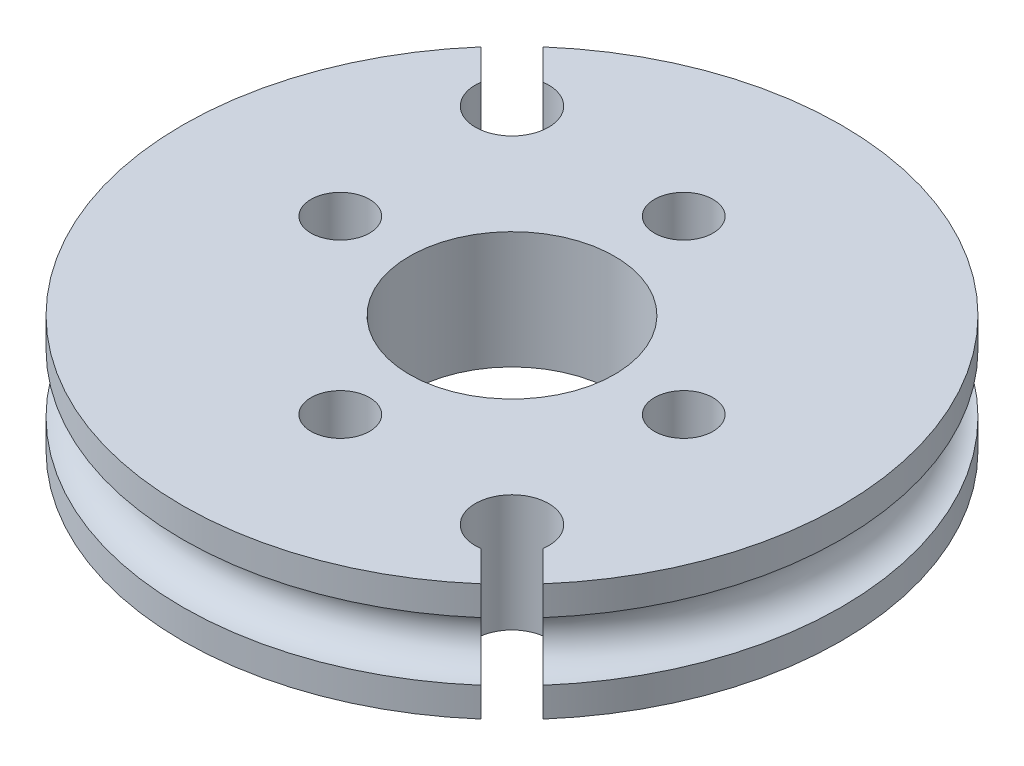
ISO-10303-21;
HEADER;
FILE_DESCRIPTION(('STEP AP214'),'2;1');
FILE_NAME('part.step','',(''),(''),'','','');
FILE_SCHEMA(('AUTOMOTIVE_DESIGN { 1 0 10303 214 1 1 1 1 }'));
ENDSEC;
DATA;
#1=APPLICATION_CONTEXT('core data for automotive mechanical design processes');
#2=APPLICATION_PROTOCOL_DEFINITION('international standard','automotive_design',2000,#1);
#3=PRODUCT_CONTEXT('',#1,'mechanical');
#4=PRODUCT('Part','Part','',(#3));
#5=PRODUCT_RELATED_PRODUCT_CATEGORY('part','',(#4));
#6=PRODUCT_DEFINITION_FORMATION('','',#4);
#7=PRODUCT_DEFINITION_CONTEXT('part definition',#1,'design');
#8=PRODUCT_DEFINITION('design','',#6,#7);
#9=PRODUCT_DEFINITION_SHAPE('','',#8);
#10=(LENGTH_UNIT() NAMED_UNIT(*) SI_UNIT(.MILLI.,.METRE.));
#11=(NAMED_UNIT(*) PLANE_ANGLE_UNIT() SI_UNIT($,.RADIAN.));
#12=(NAMED_UNIT(*) SI_UNIT($,.STERADIAN.) SOLID_ANGLE_UNIT());
#13=UNCERTAINTY_MEASURE_WITH_UNIT(LENGTH_MEASURE(1.E-05),#10,'distance_accuracy_value','');
#14=(GEOMETRIC_REPRESENTATION_CONTEXT(3) GLOBAL_UNCERTAINTY_ASSIGNED_CONTEXT((#13)) GLOBAL_UNIT_ASSIGNED_CONTEXT((#10,
#11,#12)) REPRESENTATION_CONTEXT('',''));
#15=CARTESIAN_POINT('',(0.,0.,0.));
#16=DIRECTION('',(0.,0.,1.));
#17=DIRECTION('',(1.,0.,0.));
#18=AXIS2_PLACEMENT_3D('',#15,#16,#17);
#19=CARTESIAN_POINT('',(0.,-4.,0.));
#20=DIRECTION('',(0.,1.,0.));
#21=DIRECTION('',(0.,0.,1.));
#22=AXIS2_PLACEMENT_3D('',#19,#20,#21);
#23=CYLINDRICAL_SURFACE('',#22,22.5);
#24=CARTESIAN_POINT('',(0.,-1.99999999999996,0.));
#25=DIRECTION('',(0.,1.,0.));
#26=DIRECTION('',(-1.,0.,0.));
#27=AXIS2_PLACEMENT_3D('',#24,#25,#26);
#28=CIRCLE('',#27,22.5);
#29=CARTESIAN_POINT('',(-16.9351680381673,-1.99999999999993,-14.8138476946078));
#30=VERTEX_POINT('',#29);
#31=CARTESIAN_POINT('',(14.8138476946077,-1.99999999999999,16.9351680381674));
#32=VERTEX_POINT('',#31);
#33=EDGE_CURVE('E184',#30,#32,#28,.T.);
#34=ORIENTED_EDGE('',*,*,#33,.F.);
#35=DIRECTION('',(0.,1.,0.));
#36=VECTOR('',#35,1.);
#37=CARTESIAN_POINT('',(-16.9351680381673,-4.,-14.8138476946078));
#38=LINE('',#37,#36);
#39=CARTESIAN_POINT('',(-16.9351680381673,-4.,-14.8138476946078));
#40=VERTEX_POINT('',#39);
#41=EDGE_CURVE('E266',#30,#40,#38,.F.);
#42=ORIENTED_EDGE('',*,*,#41,.T.);
#43=CARTESIAN_POINT('',(0.,-4.,0.));
#44=DIRECTION('',(0.,1.,0.));
#45=DIRECTION('',(0.,0.,1.));
#46=AXIS2_PLACEMENT_3D('',#43,#44,#45);
#47=CIRCLE('',#46,22.5);
#48=CARTESIAN_POINT('',(14.8138476946077,-4.,16.9351680381674));
#49=VERTEX_POINT('',#48);
#50=EDGE_CURVE('E176',#40,#49,#47,.T.);
#51=ORIENTED_EDGE('',*,*,#50,.T.);
#52=DIRECTION('',(0.,1.,0.));
#53=VECTOR('',#52,1.);
#54=CARTESIAN_POINT('',(14.8138476946077,-4.,16.9351680381674));
#55=LINE('',#54,#53);
#56=EDGE_CURVE('E129',#49,#32,#55,.T.);
#57=ORIENTED_EDGE('',*,*,#56,.T.);
#58=EDGE_LOOP('',(#34,#42,#51,#57));
#59=FACE_BOUND('',#58,.T.);
#60=ADVANCED_FACE('F33',(#59),#23,.T.);
#61=CARTESIAN_POINT('',(16.9351680381673,-4.,14.8138476946077));
#62=VERTEX_POINT('',#61);
#63=CARTESIAN_POINT('',(-14.8138476946077,-4.,-16.9351680381674));
#64=VERTEX_POINT('',#63);
#65=EDGE_CURVE('E178',#62,#64,#47,.T.);
#66=ORIENTED_EDGE('',*,*,#65,.T.);
#67=DIRECTION('',(0.,1.,0.));
#68=VECTOR('',#67,1.);
#69=CARTESIAN_POINT('',(-14.8138476946077,-4.,-16.9351680381674));
#70=LINE('',#69,#68);
#71=CARTESIAN_POINT('',(-14.8138476946077,-1.99999999999993,-16.9351680381674));
#72=VERTEX_POINT('',#71);
#73=EDGE_CURVE('E259',#64,#72,#70,.T.);
#74=ORIENTED_EDGE('',*,*,#73,.T.);
#75=CARTESIAN_POINT('',(16.9351680381673,-1.99999999999999,14.8138476946077));
#76=VERTEX_POINT('',#75);
#77=EDGE_CURVE('E187',#76,#72,#28,.T.);
#78=ORIENTED_EDGE('',*,*,#77,.F.);
#79=DIRECTION('',(0.,1.,0.));
#80=VECTOR('',#79,1.);
#81=CARTESIAN_POINT('',(16.9351680381673,-4.,14.8138476946077));
#82=LINE('',#81,#80);
#83=EDGE_CURVE('E251',#76,#62,#82,.F.);
#84=ORIENTED_EDGE('',*,*,#83,.T.);
#85=EDGE_LOOP('',(#66,#74,#78,#84));
#86=FACE_BOUND('',#85,.T.);
#87=ADVANCED_FACE('F217',(#86),#23,.T.);
#88=CARTESIAN_POINT('',(0.,4.,0.));
#89=DIRECTION('',(0.,1.,0.));
#90=DIRECTION('',(0.,0.,1.));
#91=AXIS2_PLACEMENT_3D('',#88,#89,#90);
#92=CIRCLE('',#91,22.5);
#93=CARTESIAN_POINT('',(-16.9351680381673,4.,-14.8138476946078));
#94=VERTEX_POINT('',#93);
#95=CARTESIAN_POINT('',(14.8138476946077,4.,16.9351680381674));
#96=VERTEX_POINT('',#95);
#97=EDGE_CURVE('E158',#94,#96,#92,.T.);
#98=ORIENTED_EDGE('',*,*,#97,.F.);
#99=DIRECTION('',(0.,1.,0.));
#100=VECTOR('',#99,1.);
#101=CARTESIAN_POINT('',(-16.9351680381673,-4.,-14.8138476946078));
#102=LINE('',#101,#100);
#103=CARTESIAN_POINT('',(-16.9351680381671,2.00000000000311,-14.8138476946075));
#104=VERTEX_POINT('',#103);
#105=EDGE_CURVE('E263',#94,#104,#102,.F.);
#106=ORIENTED_EDGE('',*,*,#105,.T.);
#107=CARTESIAN_POINT('',(0.,2.00000000000004,0.));
#108=DIRECTION('',(0.,-1.,0.));
#109=DIRECTION('',(1.,0.,0.));
#110=AXIS2_PLACEMENT_3D('',#107,#108,#109);
#111=CIRCLE('',#110,22.5);
#112=CARTESIAN_POINT('',(14.8138476946077,2.00000000000001,16.9351680381674));
#113=VERTEX_POINT('',#112);
#114=EDGE_CURVE('E182',#113,#104,#111,.T.);
#115=ORIENTED_EDGE('',*,*,#114,.F.);
#116=DIRECTION('',(0.,1.,0.));
#117=VECTOR('',#116,1.);
#118=CARTESIAN_POINT('',(14.8138476946077,-4.,16.9351680381674));
#119=LINE('',#118,#117);
#120=EDGE_CURVE('E60',#113,#96,#119,.T.);
#121=ORIENTED_EDGE('',*,*,#120,.T.);
#122=EDGE_LOOP('',(#98,#106,#115,#121));
#123=FACE_BOUND('',#122,.T.);
#124=ADVANCED_FACE('F224',(#123),#23,.T.);
#125=CARTESIAN_POINT('',(-14.8138476946077,2.00000000000006,-16.9351680381674));
#126=VERTEX_POINT('',#125);
#127=CARTESIAN_POINT('',(16.9351680381673,2.00000000000001,14.8138476946078));
#128=VERTEX_POINT('',#127);
#129=EDGE_CURVE('E179',#126,#128,#111,.T.);
#130=ORIENTED_EDGE('',*,*,#129,.F.);
#131=DIRECTION('',(0.,1.,0.));
#132=VECTOR('',#131,1.);
#133=CARTESIAN_POINT('',(-14.8138476946077,-4.,-16.9351680381674));
#134=LINE('',#133,#132);
#135=CARTESIAN_POINT('',(-14.8138476946077,4.,-16.9351680381674));
#136=VERTEX_POINT('',#135);
#137=EDGE_CURVE('E52',#126,#136,#134,.T.);
#138=ORIENTED_EDGE('',*,*,#137,.T.);
#139=CARTESIAN_POINT('',(16.9351680381673,4.,14.8138476946077));
#140=VERTEX_POINT('',#139);
#141=EDGE_CURVE('E152',#140,#136,#92,.T.);
#142=ORIENTED_EDGE('',*,*,#141,.F.);
#143=DIRECTION('',(0.,1.,0.));
#144=VECTOR('',#143,1.);
#145=CARTESIAN_POINT('',(16.9351680381673,-4.,14.8138476946077));
#146=LINE('',#145,#144);
#147=EDGE_CURVE('E145',#140,#128,#146,.F.);
#148=ORIENTED_EDGE('',*,*,#147,.T.);
#149=EDGE_LOOP('',(#130,#138,#142,#148));
#150=FACE_BOUND('',#149,.T.);
#151=ADVANCED_FACE('F219',(#150),#23,.T.);
#152=CARTESIAN_POINT('',(0.,-4.,0.));
#153=DIRECTION('',(0.,1.,0.));
#154=DIRECTION('',(0.,0.,1.));
#155=AXIS2_PLACEMENT_3D('',#152,#153,#154);
#156=PLANE('',#155);
#157=CARTESIAN_POINT('',(-11.725,-4.,0.));
#158=DIRECTION('',(0.,1.,0.));
#159=DIRECTION('',(0.,0.,1.));
#160=AXIS2_PLACEMENT_3D('',#157,#158,#159);
#161=CIRCLE('',#160,2.);
#162=CARTESIAN_POINT('',(-11.725,-4.,2.));
#163=VERTEX_POINT('',#162);
#164=EDGE_CURVE('E155',#163,#163,#161,.T.);
#165=ORIENTED_EDGE('',*,*,#164,.T.);
#166=EDGE_LOOP('',(#165));
#167=FACE_BOUND('',#166,.T.);
#168=CARTESIAN_POINT('',(0.,-4.,11.725));
#169=DIRECTION('',(0.,1.,0.));
#170=DIRECTION('',(0.,0.,1.));
#171=AXIS2_PLACEMENT_3D('',#168,#169,#170);
#172=CIRCLE('',#171,2.);
#173=CARTESIAN_POINT('',(0.,-4.,13.725));
#174=VERTEX_POINT('',#173);
#175=EDGE_CURVE('E164',#174,#174,#172,.T.);
#176=ORIENTED_EDGE('',*,*,#175,.T.);
#177=EDGE_LOOP('',(#176));
#178=FACE_BOUND('',#177,.T.);
#179=CARTESIAN_POINT('',(11.725,-4.,0.));
#180=DIRECTION('',(0.,1.,0.));
#181=DIRECTION('',(0.,0.,1.));
#182=AXIS2_PLACEMENT_3D('',#179,#180,#181);
#183=CIRCLE('',#182,2.);
#184=CARTESIAN_POINT('',(11.725,-4.,2.));
#185=VERTEX_POINT('',#184);
#186=EDGE_CURVE('E167',#185,#185,#183,.T.);
#187=ORIENTED_EDGE('',*,*,#186,.T.);
#188=EDGE_LOOP('',(#187));
#189=FACE_BOUND('',#188,.T.);
#190=CARTESIAN_POINT('',(0.,-4.,-11.725));
#191=DIRECTION('',(0.,1.,0.));
#192=DIRECTION('',(0.,0.,1.));
#193=AXIS2_PLACEMENT_3D('',#190,#191,#192);
#194=CIRCLE('',#193,2.);
#195=CARTESIAN_POINT('',(0.,-4.,-9.725));
#196=VERTEX_POINT('',#195);
#197=EDGE_CURVE('E170',#196,#196,#194,.T.);
#198=ORIENTED_EDGE('',*,*,#197,.T.);
#199=EDGE_LOOP('',(#198));
#200=FACE_BOUND('',#199,.T.);
#201=CARTESIAN_POINT('',(0.,-4.,0.));
#202=DIRECTION('',(0.,1.,0.));
#203=DIRECTION('',(0.,0.,1.));
#204=AXIS2_PLACEMENT_3D('',#201,#202,#203);
#205=CIRCLE('',#204,7.);
#206=CARTESIAN_POINT('',(0.,-4.,7.));
#207=VERTEX_POINT('',#206);
#208=EDGE_CURVE('E173',#207,#207,#205,.T.);
#209=ORIENTED_EDGE('',*,*,#208,.T.);
#210=EDGE_LOOP('',(#209));
#211=FACE_BOUND('',#210,.T.);
#212=DIRECTION('',(0.707106781186546,0.,0.707106781186549));
#213=VECTOR('',#212,1.);
#214=CARTESIAN_POINT('',(-18.3847763108502,-4.,-16.2634559672906));
#215=LINE('',#214,#213);
#216=CARTESIAN_POINT('',(-14.8492424049175,-4.,-12.7279220613579));
#217=VERTEX_POINT('',#216);
#218=EDGE_CURVE('E305',#40,#217,#215,.T.);
#219=ORIENTED_EDGE('',*,*,#218,.T.);
#220=CARTESIAN_POINT('',(-12.3743686707646,-4.,-12.3743686707646));
#221=DIRECTION('',(0.,1.,0.));
#222=DIRECTION('',(0.,0.,1.));
#223=AXIS2_PLACEMENT_3D('',#220,#221,#222);
#224=CIRCLE('',#223,2.5);
#225=CARTESIAN_POINT('',(-12.7279220613578,-4.,-14.8492424049175));
#226=VERTEX_POINT('',#225);
#227=EDGE_CURVE('E151',#217,#226,#224,.T.);
#228=ORIENTED_EDGE('',*,*,#227,.T.);
#229=DIRECTION('',(-0.707106781186547,0.,-0.707106781186548));
#230=VECTOR('',#229,1.);
#231=CARTESIAN_POINT('',(-11.3137084989847,-4.,-13.4350288425444));
#232=LINE('',#231,#230);
#233=EDGE_CURVE('E309',#226,#64,#232,.T.);
#234=ORIENTED_EDGE('',*,*,#233,.T.);
#235=ORIENTED_EDGE('',*,*,#65,.F.);
#236=DIRECTION('',(-0.707106781186547,0.,-0.707106781186548));
#237=VECTOR('',#236,1.);
#238=CARTESIAN_POINT('',(18.3847763108502,-4.,16.2634559672906));
#239=LINE('',#238,#237);
#240=CARTESIAN_POINT('',(14.8492424049175,-4.,12.7279220613579));
#241=VERTEX_POINT('',#240);
#242=EDGE_CURVE('E135',#62,#241,#239,.T.);
#243=ORIENTED_EDGE('',*,*,#242,.T.);
#244=CARTESIAN_POINT('',(12.3743686707646,-4.,12.3743686707646));
#245=DIRECTION('',(0.,1.,0.));
#246=DIRECTION('',(0.,0.,1.));
#247=AXIS2_PLACEMENT_3D('',#244,#245,#246);
#248=CIRCLE('',#247,2.5);
#249=CARTESIAN_POINT('',(12.7279220613578,-4.,14.8492424049175));
#250=VERTEX_POINT('',#249);
#251=EDGE_CURVE('E142',#241,#250,#248,.T.);
#252=ORIENTED_EDGE('',*,*,#251,.T.);
#253=DIRECTION('',(0.707106781186547,0.,0.707106781186548));
#254=VECTOR('',#253,1.);
#255=CARTESIAN_POINT('',(11.3137084989847,-4.,13.4350288425444));
#256=LINE('',#255,#254);
#257=EDGE_CURVE('E123',#250,#49,#256,.T.);
#258=ORIENTED_EDGE('',*,*,#257,.T.);
#259=ORIENTED_EDGE('',*,*,#50,.F.);
#260=EDGE_LOOP('',(#219,#228,#234,#235,#243,#252,#258,#259));
#261=FACE_BOUND('',#260,.T.);
#262=ADVANCED_FACE('F149',(#167,#178,#189,#200,#211,#261),#156,.F.);
#263=CARTESIAN_POINT('',(-12.3743686707646,-4.,-12.3743686707646));
#264=DIRECTION('',(0.,1.,0.));
#265=DIRECTION('',(0.,0.,1.));
#266=AXIS2_PLACEMENT_3D('',#263,#264,#265);
#267=CYLINDRICAL_SURFACE('',#266,2.5);
#268=DIRECTION('',(0.,1.,0.));
#269=VECTOR('',#268,1.);
#270=CARTESIAN_POINT('',(-14.8492424049175,-4.,-12.7279220613579));
#271=LINE('',#270,#269);
#272=CARTESIAN_POINT('',(-14.8492424049175,4.,-12.7279220613579));
#273=VERTEX_POINT('',#272);
#274=EDGE_CURVE('E183',#273,#217,#271,.F.);
#275=ORIENTED_EDGE('',*,*,#274,.F.);
#276=CARTESIAN_POINT('',(-12.3743686707646,4.,-12.3743686707646));
#277=DIRECTION('',(0.,1.,0.));
#278=DIRECTION('',(0.,0.,1.));
#279=AXIS2_PLACEMENT_3D('',#276,#277,#278);
#280=CIRCLE('',#279,2.5);
#281=CARTESIAN_POINT('',(-12.7279220613578,4.,-14.8492424049175));
#282=VERTEX_POINT('',#281);
#283=EDGE_CURVE('E271',#273,#282,#280,.T.);
#284=ORIENTED_EDGE('',*,*,#283,.T.);
#285=DIRECTION('',(0.,1.,0.));
#286=VECTOR('',#285,1.);
#287=CARTESIAN_POINT('',(-12.7279220613578,-4.,-14.8492424049175));
#288=LINE('',#287,#286);
#289=EDGE_CURVE('E261',#226,#282,#288,.T.);
#290=ORIENTED_EDGE('',*,*,#289,.F.);
#291=ORIENTED_EDGE('',*,*,#227,.F.);
#292=EDGE_LOOP('',(#275,#284,#290,#291));
#293=FACE_BOUND('',#292,.T.);
#294=ADVANCED_FACE('F233',(#293),#267,.F.);
#295=CARTESIAN_POINT('',(12.3743686707646,-4.,12.3743686707646));
#296=DIRECTION('',(0.,1.,0.));
#297=DIRECTION('',(0.,0.,1.));
#298=AXIS2_PLACEMENT_3D('',#295,#296,#297);
#299=CYLINDRICAL_SURFACE('',#298,2.5);
#300=DIRECTION('',(0.,1.,0.));
#301=VECTOR('',#300,1.);
#302=CARTESIAN_POINT('',(14.8492424049175,-4.,12.7279220613579));
#303=LINE('',#302,#301);
#304=CARTESIAN_POINT('',(14.8492424049175,4.,12.7279220613579));
#305=VERTEX_POINT('',#304);
#306=EDGE_CURVE('E253',#305,#241,#303,.F.);
#307=ORIENTED_EDGE('',*,*,#306,.F.);
#308=CARTESIAN_POINT('',(12.3743686707646,4.,12.3743686707646));
#309=DIRECTION('',(0.,1.,0.));
#310=DIRECTION('',(0.,0.,1.));
#311=AXIS2_PLACEMENT_3D('',#308,#309,#310);
#312=CIRCLE('',#311,2.5);
#313=CARTESIAN_POINT('',(12.7279220613578,4.,14.8492424049175));
#314=VERTEX_POINT('',#313);
#315=EDGE_CURVE('E144',#305,#314,#312,.T.);
#316=ORIENTED_EDGE('',*,*,#315,.T.);
#317=DIRECTION('',(0.,1.,0.));
#318=VECTOR('',#317,1.);
#319=CARTESIAN_POINT('',(12.7279220613578,-4.,14.8492424049175));
#320=LINE('',#319,#318);
#321=EDGE_CURVE('E126',#250,#314,#320,.T.);
#322=ORIENTED_EDGE('',*,*,#321,.F.);
#323=ORIENTED_EDGE('',*,*,#251,.F.);
#324=EDGE_LOOP('',(#307,#316,#322,#323));
#325=FACE_BOUND('',#324,.T.);
#326=ADVANCED_FACE('F141',(#325),#299,.F.);
#327=CARTESIAN_POINT('',(0.,4.,0.));
#328=DIRECTION('',(0.,1.,0.));
#329=DIRECTION('',(0.,0.,1.));
#330=AXIS2_PLACEMENT_3D('',#327,#328,#329);
#331=PLANE('',#330);
#332=CARTESIAN_POINT('',(0.,4.,11.725));
#333=DIRECTION('',(0.,1.,0.));
#334=DIRECTION('',(0.,0.,1.));
#335=AXIS2_PLACEMENT_3D('',#332,#333,#334);
#336=CIRCLE('',#335,2.);
#337=CARTESIAN_POINT('',(0.,4.,13.725));
#338=VERTEX_POINT('',#337);
#339=EDGE_CURVE('E277',#338,#338,#336,.T.);
#340=ORIENTED_EDGE('',*,*,#339,.F.);
#341=EDGE_LOOP('',(#340));
#342=FACE_BOUND('',#341,.T.);
#343=CARTESIAN_POINT('',(0.,4.,-11.725));
#344=DIRECTION('',(0.,1.,0.));
#345=DIRECTION('',(0.,0.,1.));
#346=AXIS2_PLACEMENT_3D('',#343,#344,#345);
#347=CIRCLE('',#346,2.);
#348=CARTESIAN_POINT('',(0.,4.,-9.725));
#349=VERTEX_POINT('',#348);
#350=EDGE_CURVE('E283',#349,#349,#347,.T.);
#351=ORIENTED_EDGE('',*,*,#350,.F.);
#352=EDGE_LOOP('',(#351));
#353=FACE_BOUND('',#352,.T.);
#354=CARTESIAN_POINT('',(0.,4.,0.));
#355=DIRECTION('',(0.,1.,0.));
#356=DIRECTION('',(0.,0.,1.));
#357=AXIS2_PLACEMENT_3D('',#354,#355,#356);
#358=CIRCLE('',#357,7.);
#359=CARTESIAN_POINT('',(0.,4.,7.));
#360=VERTEX_POINT('',#359);
#361=EDGE_CURVE('E285',#360,#360,#358,.T.);
#362=ORIENTED_EDGE('',*,*,#361,.F.);
#363=EDGE_LOOP('',(#362));
#364=FACE_BOUND('',#363,.T.);
#365=CARTESIAN_POINT('',(11.725,4.,0.));
#366=DIRECTION('',(0.,1.,0.));
#367=DIRECTION('',(0.,0.,1.));
#368=AXIS2_PLACEMENT_3D('',#365,#366,#367);
#369=CIRCLE('',#368,2.);
#370=CARTESIAN_POINT('',(11.725,4.,2.));
#371=VERTEX_POINT('',#370);
#372=EDGE_CURVE('E280',#371,#371,#369,.T.);
#373=ORIENTED_EDGE('',*,*,#372,.F.);
#374=EDGE_LOOP('',(#373));
#375=FACE_BOUND('',#374,.T.);
#376=CARTESIAN_POINT('',(-11.725,4.,0.));
#377=DIRECTION('',(0.,1.,0.));
#378=DIRECTION('',(0.,0.,1.));
#379=AXIS2_PLACEMENT_3D('',#376,#377,#378);
#380=CIRCLE('',#379,2.);
#381=CARTESIAN_POINT('',(-11.725,4.,2.));
#382=VERTEX_POINT('',#381);
#383=EDGE_CURVE('E274',#382,#382,#380,.T.);
#384=ORIENTED_EDGE('',*,*,#383,.F.);
#385=EDGE_LOOP('',(#384));
#386=FACE_BOUND('',#385,.T.);
#387=ORIENTED_EDGE('',*,*,#283,.F.);
#388=DIRECTION('',(0.707106781186546,0.,0.707106781186549));
#389=VECTOR('',#388,1.);
#390=CARTESIAN_POINT('',(-18.3847763108502,4.,-16.2634559672906));
#391=LINE('',#390,#389);
#392=EDGE_CURVE('E296',#94,#273,#391,.T.);
#393=ORIENTED_EDGE('',*,*,#392,.F.);
#394=ORIENTED_EDGE('',*,*,#97,.T.);
#395=DIRECTION('',(0.707106781186547,0.,0.707106781186548));
#396=VECTOR('',#395,1.);
#397=CARTESIAN_POINT('',(11.3137084989847,4.,13.4350288425444));
#398=LINE('',#397,#396);
#399=EDGE_CURVE('E295',#314,#96,#398,.T.);
#400=ORIENTED_EDGE('',*,*,#399,.F.);
#401=ORIENTED_EDGE('',*,*,#315,.F.);
#402=DIRECTION('',(-0.707106781186547,0.,-0.707106781186548));
#403=VECTOR('',#402,1.);
#404=CARTESIAN_POINT('',(18.3847763108502,4.,16.2634559672906));
#405=LINE('',#404,#403);
#406=EDGE_CURVE('E134',#140,#305,#405,.T.);
#407=ORIENTED_EDGE('',*,*,#406,.F.);
#408=ORIENTED_EDGE('',*,*,#141,.T.);
#409=DIRECTION('',(-0.707106781186547,0.,-0.707106781186548));
#410=VECTOR('',#409,1.);
#411=CARTESIAN_POINT('',(-11.3137084989847,4.,-13.4350288425444));
#412=LINE('',#411,#410);
#413=EDGE_CURVE('E299',#282,#136,#412,.T.);
#414=ORIENTED_EDGE('',*,*,#413,.F.);
#415=EDGE_LOOP('',(#387,#393,#394,#400,#401,#407,#408,#414));
#416=FACE_BOUND('',#415,.T.);
#417=ADVANCED_FACE('F294',(#342,#353,#364,#375,#386,#416),#331,.T.);
#418=CARTESIAN_POINT('',(0.,0.,0.));
#419=DIRECTION('',(0.,-1.,0.));
#420=DIRECTION('',(1.,0.,0.));
#421=AXIS2_PLACEMENT_3D('',#418,#419,#420);
#422=TOROIDAL_SURFACE('',#421,22.5,2.);
#423=CARTESIAN_POINT('',(-17.8078777010762,-1.57580910717239,-15.6865573575166));
#424=CARTESIAN_POINT('',(-17.7450513192369,-1.64510571046001,-15.6237309756774));
#425=CARTESIAN_POINT('',(-17.6780347038523,-1.70693955571129,-15.5567143602927));
#426=CARTESIAN_POINT('',(-17.5375527624265,-1.81386043191241,-15.416232418867));
#427=CARTESIAN_POINT('',(-17.4640796148098,-1.85892679479812,-15.3427592712502));
#428=CARTESIAN_POINT('',(-17.312861199007,-1.93095972182876,-15.1915408554475));
#429=CARTESIAN_POINT('',(-17.235118298475,-1.95793620965629,-15.1137979549154));
#430=CARTESIAN_POINT('',(-17.0775565171869,-1.99306218523836,-14.9562361736273));
#431=CARTESIAN_POINT('',(-16.9977381590967,-2.00121636748623,-14.8764178155371));
#432=CARTESIAN_POINT('',(-16.838167954277,-1.99848858663707,-14.7168476107174));
#433=CARTESIAN_POINT('',(-16.7584163015849,-1.98758382124418,-14.6370959580253));
#434=CARTESIAN_POINT('',(-16.6013344508087,-1.9470013243761,-14.4800141072491));
#435=CARTESIAN_POINT('',(-16.5240043608355,-1.91732275599313,-14.4026840172759));
#436=CARTESIAN_POINT('',(-16.3739378365664,-1.84001267018175,-14.2526174930068));
#437=CARTESIAN_POINT('',(-16.3012030409482,-1.79237479020037,-14.1798826973886));
#438=CARTESIAN_POINT('',(-16.1624296695743,-1.68048748376149,-14.0411093260147));
#439=CARTESIAN_POINT('',(-16.0963910543412,-1.61623815524483,-13.9750707107816));
#440=CARTESIAN_POINT('',(-15.9729689175474,-1.47302177699155,-13.8516485739878));
#441=CARTESIAN_POINT('',(-15.9155757038576,-1.39407143367617,-13.794255360298));
#442=CARTESIAN_POINT('',(-15.811002519458,-1.22363727541041,-13.6896821758984));
#443=CARTESIAN_POINT('',(-15.7638224088928,-1.13215363211544,-13.6425020653332));
#444=CARTESIAN_POINT('',(-15.6811312081859,-0.939471875055098,-13.5598108646263));
#445=CARTESIAN_POINT('',(-15.6455937085984,-0.838296429497762,-13.5242733650388));
#446=CARTESIAN_POINT('',(-15.5870667467962,-0.628929935168738,-13.4657464032366));
#447=CARTESIAN_POINT('',(-15.5640771180764,-0.520738979511285,-13.4427567745168));
#448=CARTESIAN_POINT('',(-15.5313513314167,-0.300688633286806,-13.4100309878571));
#449=CARTESIAN_POINT('',(-15.5215838375143,-0.18883856190446,-13.4002634939547));
#450=CARTESIAN_POINT('',(-15.5154832107106,0.0355914454156534,-13.394162867151));
#451=CARTESIAN_POINT('',(-15.5191499511378,0.148171374461591,-13.3978296075782));
#452=CARTESIAN_POINT('',(-15.5397989246569,0.370724108492265,-13.4184785810973));
#453=CARTESIAN_POINT('',(-15.5567652567657,0.480699865368735,-13.4354449132061));
#454=CARTESIAN_POINT('',(-15.6035043460554,0.695066217738857,-13.4821840024959));
#455=CARTESIAN_POINT('',(-15.6332771211868,0.799456805403708,-13.5119567776272));
#456=CARTESIAN_POINT('',(-15.7047971308641,0.999769299856927,-13.5834767873045));
#457=CARTESIAN_POINT('',(-15.7465522717616,1.09568556017768,-13.625231928202));
#458=CARTESIAN_POINT('',(-15.840833556171,1.27627055539859,-13.7195132126114));
#459=CARTESIAN_POINT('',(-15.8933598113013,1.36093917372712,-13.7720394677417));
#460=CARTESIAN_POINT('',(-16.0078101732811,1.51682136605011,-13.8864898297215));
#461=CARTESIAN_POINT('',(-16.0697541019224,1.58800583239835,-13.9484337583628));
#462=CARTESIAN_POINT('',(-16.2011959846652,1.71470025558294,-14.0798756411056));
#463=CARTESIAN_POINT('',(-16.2706940419979,1.77020999817862,-14.1493736984383));
#464=CARTESIAN_POINT('',(-16.4154544020913,1.86411868150712,-14.2941340585317));
#465=CARTESIAN_POINT('',(-16.4907303798876,1.9024754643708,-14.369410036328));
#466=CARTESIAN_POINT('',(-16.6447634789574,1.96080383920798,-14.5234431353978));
#467=CARTESIAN_POINT('',(-16.7235206349385,1.9807752478341,-14.6022002913789));
#468=CARTESIAN_POINT('',(-16.8824123895972,2.00178783274817,-14.7610920460376));
#469=CARTESIAN_POINT('',(-16.9625489489126,2.00279937067922,-14.841228605353));
#470=CARTESIAN_POINT('',(-17.1218053742793,1.98578393807283,-15.0004850307197));
#471=CARTESIAN_POINT('',(-17.2009252373167,1.96775691111059,-15.0796048937571));
#472=CARTESIAN_POINT('',(-17.3559076042958,1.91316375793855,-15.2345872607362));
#473=CARTESIAN_POINT('',(-17.4317698183711,1.87659598566082,-15.3104494748115));
#474=CARTESIAN_POINT('',(-17.5780683744501,1.78594596885861,-15.4567480308905));
#475=CARTESIAN_POINT('',(-17.6485047497437,1.73186383180276,-15.5271844061841));
#476=CARTESIAN_POINT('',(-17.7818566403918,1.60778672471175,-15.6605362968322));
#477=CARTESIAN_POINT('',(-17.8447813478577,1.53781151415159,-15.7234610042982));
#478=CARTESIAN_POINT('',(-17.9614107271655,1.38388800299542,-15.840090383606));
#479=CARTESIAN_POINT('',(-18.0151154723457,1.29993981355511,-15.8937951287861));
#480=CARTESIAN_POINT('',(-18.1116705185536,1.12062522293648,-15.990350174994));
#481=CARTESIAN_POINT('',(-18.1545413954866,1.02528098070918,-16.033221051927));
#482=CARTESIAN_POINT('',(-18.228332282117,0.825752608732062,-16.1070119385574));
#483=CARTESIAN_POINT('',(-18.2592523909295,0.721568552304989,-16.1379320473699));
#484=CARTESIAN_POINT('',(-18.3082085449492,0.507518266548596,-16.1868882013896));
#485=CARTESIAN_POINT('',(-18.3262674601433,0.397662497847929,-16.2049471165837));
#486=CARTESIAN_POINT('',(-18.3490715254379,0.175225654932203,-16.2277511818783));
#487=CARTESIAN_POINT('',(-18.3538172962131,0.0626447080150398,-16.2324969526535));
#488=CARTESIAN_POINT('',(-18.349863220618,-0.161912558672332,-16.2285428770584));
#489=CARTESIAN_POINT('',(-18.3411788986666,-0.27388942662834,-16.219858555107));
#490=CARTESIAN_POINT('',(-18.3106367998674,-0.494221844782843,-16.1893164563078));
#491=CARTESIAN_POINT('',(-18.2887757622058,-0.602576491590267,-16.1674554186463));
#492=CARTESIAN_POINT('',(-18.2324967606201,-0.812606835208619,-16.1111764170605));
#493=CARTESIAN_POINT('',(-18.1980722703026,-0.914279028201883,-16.076751926743));
#494=CARTESIAN_POINT('',(-18.1176739403385,-1.10792482138191,-15.9963535967789));
#495=CARTESIAN_POINT('',(-18.0717140217567,-1.19990992344864,-15.9503936781971));
#496=CARTESIAN_POINT('',(-17.9889071165659,-1.3391805040065,-15.8675867730063));
#497=CARTESIAN_POINT('',(-17.9551705928059,-1.39023065271069,-15.8338502492464));
#498=CARTESIAN_POINT('',(-17.8841180843798,-1.48707842567898,-15.7627977408202));
#499=CARTESIAN_POINT('',(-17.8468020999392,-1.53287605027412,-15.7254817563796));
#500=CARTESIAN_POINT('',(-17.8078777010762,-1.57580910717239,-15.6865573575166));
#501=B_SPLINE_CURVE_WITH_KNOTS('',3,(#423,#424,#425,#426,#427,#428,#429,#430,#431,#432,#433,
#434,#435,#436,#437,#438,#439,#440,#441,#442,#443,#444,#445,#446,#447,#448,#449,#450,#451,#452,
#453,#454,#455,#456,#457,#458,#459,#460,#461,#462,#463,#464,#465,#466,#467,#468,#469,#470,#471,
#472,#473,#474,#475,#476,#477,#478,#479,#480,#481,#482,#483,#484,#485,#486,#487,#488,#489,#490,
#491,#492,#493,#494,#495,#496,#497,#498,#499,#500),.UNSPECIFIED.,.T.,.F.,(4,2,2,2,2,2,2,2,2,2,2,
2,2,2,2,2,2,2,2,2,2,2,2,2,2,2,2,2,2,2,2,2,2,2,2,2,2,2,4),(0.,0.33777856698683,0.675972120575584,
1.01397999698234,1.35190356133492,1.69023169727264,2.02857491643046,2.36703811528353,
2.70549931860872,3.0435782120666,3.38165247567677,3.71895447360821,4.0562519955727,
4.39274872729735,4.72924228619773,5.06533414610056,5.40142647709519,5.73774108457904,
6.07405917738729,6.41109519219049,6.74813581334779,7.08600030725011,7.42386817045552,
7.7622641498472,8.1006611321497,8.43908816297379,8.77751311723972,9.11551959704745,
9.45352338812662,9.79088032752641,10.128234468958,10.4649872136154,10.8017242581965,
11.1380723448673,11.4745037010759,11.8111100741385,12.1473121643595,12.3565845768794,
12.5658569762101),.UNSPECIFIED.);
#502=EDGE_CURVE('E11',#30,#104,#501,.T.);
#503=ORIENTED_EDGE('',*,*,#502,.F.);
#504=ORIENTED_EDGE('',*,*,#33,.T.);
#505=CARTESIAN_POINT('',(13.6228031977785,-1.08464440813154,15.7441235413382));
#506=CARTESIAN_POINT('',(13.6660405319516,-1.1791181567513,15.7873608755113));
#507=CARTESIAN_POINT('',(13.7149622582125,-1.26848800530405,15.8362826017722));
#508=CARTESIAN_POINT('',(13.8227690027744,-1.43440837868366,15.9440893463341));
#509=CARTESIAN_POINT('',(13.8816662432309,-1.51094294579457,16.0029865867906));
#510=CARTESIAN_POINT('',(14.0076777355933,-1.64891120873612,16.1289980791529));
#511=CARTESIAN_POINT('',(14.0747872053706,-1.71035363089142,16.1961075489303));
#512=CARTESIAN_POINT('',(14.2153192959789,-1.81644543358605,16.3366396395386));
#513=CARTESIAN_POINT('',(14.2887403417144,-1.8610989890367,16.4100606852741));
#514=CARTESIAN_POINT('',(14.4399649904346,-1.93245159289753,16.5612853339943));
#515=CARTESIAN_POINT('',(14.5177759994976,-1.95911925334431,16.6390963430573));
#516=CARTESIAN_POINT('',(14.6754615874642,-1.99362584575636,16.7967819310239));
#517=CARTESIAN_POINT('',(14.7553362647113,-2.00146387872203,16.876656608271));
#518=CARTESIAN_POINT('',(14.9149721690215,-1.99808414464144,17.0362925125812));
#519=CARTESIAN_POINT('',(14.9947331749617,-1.98684542788897,17.1160535185214));
#520=CARTESIAN_POINT('',(15.1517877720167,-1.9455831458838,17.2731081155764));
#521=CARTESIAN_POINT('',(15.2290813680868,-1.91555961836101,17.3504017116465));
#522=CARTESIAN_POINT('',(15.3789729669977,-1.83758320043734,17.5002933105574));
#523=CARTESIAN_POINT('',(15.4515727532321,-1.78963716713622,17.5728930967918));
#524=CARTESIAN_POINT('',(15.5900378131964,-1.67716302426074,17.7113581567561));
#525=CARTESIAN_POINT('',(15.6559031466697,-1.61263506180722,17.7772234902294));
#526=CARTESIAN_POINT('',(15.7789195941259,-1.46893162030865,17.9002399376856));
#527=CARTESIAN_POINT('',(15.8360839458756,-1.38977880625463,17.9574042894353));
#528=CARTESIAN_POINT('',(15.9401822952161,-1.21900071785007,18.0615026387758));
#529=CARTESIAN_POINT('',(15.9871163880734,-1.12737555965784,18.1084367316331));
#530=CARTESIAN_POINT('',(16.0693247658222,-0.934446681605122,18.1906451093819));
#531=CARTESIAN_POINT('',(16.104621721831,-0.833162282134637,18.2259420653907));
#532=CARTESIAN_POINT('',(16.1626684942873,-0.623641268091287,18.283988837847));
#533=CARTESIAN_POINT('',(16.1854184372252,-0.515404723617558,18.3067387807849));
#534=CARTESIAN_POINT('',(16.2176907180946,-0.295240098974796,18.3390110616543));
#535=CARTESIAN_POINT('',(16.2272343935211,-0.183318273464028,18.3485547370808));
#536=CARTESIAN_POINT('',(16.2328890851793,0.0412017402806136,18.354209428739));
#537=CARTESIAN_POINT('',(16.2290001748047,0.153799924815604,18.3503205183644));
#538=CARTESIAN_POINT('',(16.2079091853665,0.376391122676369,18.3292295289262));
#539=CARTESIAN_POINT('',(16.1907166987585,0.486385954263973,18.3120370423182));
#540=CARTESIAN_POINT('',(16.143523013965,0.700734866972133,18.2648433575246));
#541=CARTESIAN_POINT('',(16.1135218130921,0.805088946909214,18.2348421566518));
#542=CARTESIAN_POINT('',(16.0415542985543,1.00524328977699,18.162874642114));
#543=CARTESIAN_POINT('',(15.9995831253582,1.10104005785237,18.1209034689179));
#544=CARTESIAN_POINT('',(15.904879108626,1.28132681891079,18.0261994521857));
#545=CARTESIAN_POINT('',(15.852146199161,1.36581674262011,17.9734665427207));
#546=CARTESIAN_POINT('',(15.7373388518895,1.52122153068554,17.8586591954492));
#547=CARTESIAN_POINT('',(15.6752514135528,1.59211718567809,17.7965717571125));
#548=CARTESIAN_POINT('',(15.5435551440848,1.71819465269688,17.6648754876445));
#549=CARTESIAN_POINT('',(15.4739462383072,1.77337630875083,17.5952665818669));
#550=CARTESIAN_POINT('',(15.3290393067074,1.86657259160202,17.4503596502671));
#551=CARTESIAN_POINT('',(15.2537305563657,1.90455386828945,17.3750508999254));
#552=CARTESIAN_POINT('',(15.0996773937466,1.96213202603888,17.2209977373063));
#553=CARTESIAN_POINT('',(15.0209329437744,1.98172870534061,17.1422532873341));
#554=CARTESIAN_POINT('',(14.8620968666202,2.00201119812315,16.9834172101799));
#555=CARTESIAN_POINT('',(14.7820031304108,2.00266398817979,16.9033234739705));
#556=CARTESIAN_POINT('',(14.6228728681847,1.98496029995398,16.7441932117444));
#557=CARTESIAN_POINT('',(14.5438363480732,1.9666037155384,16.6651566916329));
#558=CARTESIAN_POINT('',(14.3889999715875,1.91137632085433,16.5103203151472));
#559=CARTESIAN_POINT('',(14.3132027042199,1.87449099086334,16.4345230477796));
#560=CARTESIAN_POINT('',(14.1670665624994,1.7832359465973,16.2883869060591));
#561=CARTESIAN_POINT('',(14.0967276919265,1.72886622021406,16.2180480354862));
#562=CARTESIAN_POINT('',(13.9635607517039,1.60421607321202,16.0848810952636));
#563=CARTESIAN_POINT('',(13.9007276227327,1.53394646359726,16.0220479662923));
#564=CARTESIAN_POINT('',(13.7843159783572,1.37945870139113,15.9056363219169));
#565=CARTESIAN_POINT('',(13.730737390704,1.29524065770341,15.8520577342637));
#566=CARTESIAN_POINT('',(13.634473638595,1.11542399729649,15.7557939821547));
#567=CARTESIAN_POINT('',(13.5917668886932,1.01984849276536,15.7130872322528));
#568=CARTESIAN_POINT('',(13.5183403552061,0.81989830749896,15.6396606987658));
#569=CARTESIAN_POINT('',(13.4876199264215,0.71552410074793,15.6089402699812));
#570=CARTESIAN_POINT('',(13.4391161338077,0.501226955560698,15.5604364773674));
#571=CARTESIAN_POINT('',(13.4212994512755,0.391319096965788,15.5426197948352));
#572=CARTESIAN_POINT('',(13.3989874009059,0.168801129650197,15.5203077444656));
#573=CARTESIAN_POINT('',(13.3944952098664,0.0561903829628549,15.5158155534261));
#574=CARTESIAN_POINT('',(13.3989641623814,-0.168350649195863,15.520284505941));
#575=CARTESIAN_POINT('',(13.4079093534762,-0.280281583392452,15.5292296970359));
#576=CARTESIAN_POINT('',(13.4389637616394,-0.50033237867666,15.5602841051991));
#577=CARTESIAN_POINT('',(13.4610570361294,-0.608456687555895,15.5823773796891));
#578=CARTESIAN_POINT('',(13.5069601408576,-0.778125613313654,15.6282804844173));
#579=CARTESIAN_POINT('',(13.5269463033846,-0.841793629373538,15.6482666469443));
#580=CARTESIAN_POINT('',(13.5714980166726,-0.965839920794016,15.6928183602323));
#581=CARTESIAN_POINT('',(13.5960635631612,-1.02621819922376,15.7173839067209));
#582=CARTESIAN_POINT('',(13.6228031977785,-1.08464440813154,15.7441235413382));
#583=B_SPLINE_CURVE_WITH_KNOTS('',3,(#505,#506,#507,#508,#509,#510,#511,#512,#513,#514,#515,
#516,#517,#518,#519,#520,#521,#522,#523,#524,#525,#526,#527,#528,#529,#530,#531,#532,#533,#534,
#535,#536,#537,#538,#539,#540,#541,#542,#543,#544,#545,#546,#547,#548,#549,#550,#551,#552,#553,
#554,#555,#556,#557,#558,#559,#560,#561,#562,#563,#564,#565,#566,#567,#568,#569,#570,#571,#572,
#573,#574,#575,#576,#577,#578,#579,#580,#581,#582),.UNSPECIFIED.,.T.,.F.,(4,2,2,2,2,2,2,2,2,2,2,
2,2,2,2,2,2,2,2,2,2,2,2,2,2,2,2,2,2,2,2,2,2,2,2,2,2,2,4),(0.,0.337351462239999,
0.675119282982768,1.01269134316252,1.35017940321082,1.68825491476928,2.02634656704611,
2.3648097450933,2.70327224332825,3.04160537909353,3.37993551314898,3.71774564930402,
4.05555263955774,4.39269758121897,4.72983912394938,5.06643530525553,5.40302964745213,
5.73938151641733,6.07573345595162,6.41222214143302,6.74871288838787,7.08567566473302,
7.42264178554969,7.76025848745929,8.09787889447237,8.43608781386869,8.77429862156292,
9.11277487656742,9.4512513659717,9.78949839879895,10.1277427908565,10.4653102850964,
10.8028596062526,11.1395342049659,11.4762890664963,11.8126444585142,12.1485928347375,
12.3572241813814,12.5658553333801),.UNSPECIFIED.);
#584=EDGE_CURVE('E188',#113,#32,#583,.T.);
#585=ORIENTED_EDGE('',*,*,#584,.F.);
#586=ORIENTED_EDGE('',*,*,#114,.T.);
#587=EDGE_LOOP('',(#503,#504,#585,#586));
#588=FACE_BOUND('',#587,.T.);
#589=ADVANCED_FACE('F199',(#588),#422,.F.);
#590=CARTESIAN_POINT('',(-15.6865573575165,-1.57580910717239,-17.8078777010762));
#591=CARTESIAN_POINT('',(-15.7492009176251,-1.50670152001238,-17.8705212611848));
#592=CARTESIAN_POINT('',(-15.8077688238759,-1.43007360896624,-17.9290891674356));
#593=CARTESIAN_POINT('',(-15.915028303711,-1.26394000935102,-18.0363486472707));
#594=CARTESIAN_POINT('',(-15.9637081363738,-1.17441922498298,-18.0850284799335));
#595=CARTESIAN_POINT('',(-16.0497261886385,-0.985111073875105,-18.1710465321982));
#596=CARTESIAN_POINT('',(-16.0870689503418,-0.885327840206533,-18.2083892939015));
#597=CARTESIAN_POINT('',(-16.1493514970799,-0.678329856218444,-18.2706718406396));
#598=CARTESIAN_POINT('',(-16.1742943488207,-0.571116950862708,-18.2956146923804));
#599=CARTESIAN_POINT('',(-16.2110561765453,-0.352405029787372,-18.332376520105));
#600=CARTESIAN_POINT('',(-16.2228894543803,-0.2409108224593,-18.34420979794));
#601=CARTESIAN_POINT('',(-16.2331406289144,-0.016691821946356,-18.3544609724741));
#602=CARTESIAN_POINT('',(-16.2315580878125,0.096033011277897,-18.3528784313722));
#603=CARTESIAN_POINT('',(-16.2150291234895,0.319410687430154,-18.3363494670492));
#604=CARTESIAN_POINT('',(-16.2000937836913,0.430065171087547,-18.321414127251));
#605=CARTESIAN_POINT('',(-16.1573028223147,0.646258819041254,-18.2786231658744));
#606=CARTESIAN_POINT('',(-16.1294472303245,0.751797995051354,-18.2507675738842));
#607=CARTESIAN_POINT('',(-16.0616024035701,0.954804258369551,-18.1829227471298));
#608=CARTESIAN_POINT('',(-16.0216093881136,1.05226881845217,-18.1429297316733));
#609=CARTESIAN_POINT('',(-15.9306352643861,1.23633542612846,-18.0519556079458));
#610=CARTESIAN_POINT('',(-15.8796541135283,1.32293743161993,-18.000974457088));
#611=CARTESIAN_POINT('',(-15.7680808437167,1.48294765935521,-17.8894011872764));
#612=CARTESIAN_POINT('',(-15.7074760170335,1.55633815896852,-17.8287963605932));
#613=CARTESIAN_POINT('',(-15.5784282196519,1.68772104387924,-17.6997485632116));
#614=CARTESIAN_POINT('',(-15.5099851638136,1.74571326189535,-17.6313055073733));
#615=CARTESIAN_POINT('',(-15.3670641434787,1.8447715349041,-17.4883844870384));
#616=CARTESIAN_POINT('',(-15.2925748976592,1.88580503648953,-17.4138952412189));
#617=CARTESIAN_POINT('',(-15.139787699279,1.94963955035337,-17.2611080428387));
#618=CARTESIAN_POINT('',(-15.061489707521,1.97244037494948,-17.1828100510807));
#619=CARTESIAN_POINT('',(-14.9031575490419,1.99919978751881,-17.0244778926016));
#620=CARTESIAN_POINT('',(-14.8231205250004,2.00312456909022,-16.94444086856));
#621=CARTESIAN_POINT('',(-14.6637145120024,1.99193411320084,-16.7850348555621));
#622=CARTESIAN_POINT('',(-14.5843455279186,1.97681873698374,-16.7056658714783));
#623=CARTESIAN_POINT('',(-14.4284548434863,1.92795208477226,-16.549775187046));
#624=CARTESIAN_POINT('',(-14.3519357502608,1.8941841714655,-16.4732560938205));
#625=CARTESIAN_POINT('',(-14.2039951763732,1.80895063847258,-16.3253155199329));
#626=CARTESIAN_POINT('',(-14.1325736935791,1.75748502618884,-16.2538940371388));
#627=CARTESIAN_POINT('',(-13.9969018375351,1.63833749461204,-16.1182221810948));
#628=CARTESIAN_POINT('',(-13.9326475810874,1.57066441967749,-16.053967924647));
#629=CARTESIAN_POINT('',(-13.8131041745428,1.42099605249988,-15.9344245181025));
#630=CARTESIAN_POINT('',(-13.757814942972,1.33900089042981,-15.8791352865317));
#631=CARTESIAN_POINT('',(-13.6578884075862,1.16318141090974,-15.7792087511459));
#632=CARTESIAN_POINT('',(-13.61323076229,1.06938021659596,-15.7345511058497));
#633=CARTESIAN_POINT('',(-13.5357173797818,0.87248524658046,-15.6570377233415));
#634=CARTESIAN_POINT('',(-13.5028614724766,0.769391604833428,-15.6241818160363));
#635=CARTESIAN_POINT('',(-13.4499691394412,0.557114417406371,-15.5712894830009));
#636=CARTESIAN_POINT('',(-13.4299009231476,0.447946713269303,-15.5512212667072));
#637=CARTESIAN_POINT('',(-13.4030349026502,0.22639315418888,-15.5243552462099));
#638=CARTESIAN_POINT('',(-13.3962369451817,0.114007336428315,-15.5175572887414));
#639=CARTESIAN_POINT('',(-13.3961083393461,-0.110578501914146,-15.5174286829058));
#640=CARTESIAN_POINT('',(-13.4027537097593,-0.222778496637859,-15.524074053319));
#641=CARTESIAN_POINT('',(-13.4292713128078,-0.444006839022678,-15.5505916563675));
#642=CARTESIAN_POINT('',(-13.4491434925834,-0.553035199357091,-15.5704638361431));
#643=CARTESIAN_POINT('',(-13.5015395024442,-0.764821855021006,-15.6228598460039));
#644=CARTESIAN_POINT('',(-13.5340623797735,-0.867580621855324,-15.6553827233332));
#645=CARTESIAN_POINT('',(-13.6108257500319,-1.0639358496505,-15.7321460935916));
#646=CARTESIAN_POINT('',(-13.655066350239,-1.15753222671716,-15.7763866937987));
#647=CARTESIAN_POINT('',(-13.7540839684454,-1.3330775467488,-15.8754043120051));
#648=CARTESIAN_POINT('',(-13.8088784532743,-1.41500678392119,-15.930198796834));
#649=CARTESIAN_POINT('',(-13.9273944754166,-1.56473259312504,-16.0487148189763));
#650=CARTESIAN_POINT('',(-13.9911161487371,-1.63252894980067,-16.1124364922968));
#651=CARTESIAN_POINT('',(-14.1258485603275,-1.75224307416445,-16.2471689038872));
#652=CARTESIAN_POINT('',(-14.1968771257815,-1.80412071517977,-16.3181974693412));
#653=CARTESIAN_POINT('',(-14.3440732003625,-1.89031274472054,-16.4653935439222));
#654=CARTESIAN_POINT('',(-14.4202405710292,-1.92462760624465,-16.5415609145889));
#655=CARTESIAN_POINT('',(-14.5757113812523,-1.97478513871161,-16.697031724812));
#656=CARTESIAN_POINT('',(-14.655020542908,-1.99059233670857,-16.7763408864677));
#657=CARTESIAN_POINT('',(-14.8144119390019,-2.00316898013038,-16.9357322825616));
#658=CARTESIAN_POINT('',(-14.8944943642398,-1.99993360048433,-17.0158147077995));
#659=CARTESIAN_POINT('',(-15.0532253041278,-1.97449343583468,-17.1745456476875));
#660=CARTESIAN_POINT('',(-15.1318720487994,-1.95226666374799,-17.2531923923591));
#661=CARTESIAN_POINT('',(-15.2853374945804,-1.88944411736473,-17.4066578381401));
#662=CARTESIAN_POINT('',(-15.360160684125,-1.84887045854896,-17.4814810276847));
#663=CARTESIAN_POINT('',(-15.4770718580205,-1.76890712846539,-17.5983922015802));
#664=CARTESIAN_POINT('',(-15.5209726705343,-1.7347048195165,-17.642293014094));
#665=CARTESIAN_POINT('',(-15.6059744352679,-1.65993381514039,-17.7272947788276));
#666=CARTESIAN_POINT('',(-15.6470753874656,-1.61936511966303,-17.7683957310253));
#667=CARTESIAN_POINT('',(-15.6865573575165,-1.57580910717239,-17.8078777010762));
#668=B_SPLINE_CURVE_WITH_KNOTS('',3,(#590,#591,#592,#593,#594,#595,#596,#597,#598,#599,#600,
#601,#602,#603,#604,#605,#606,#607,#608,#609,#610,#611,#612,#613,#614,#615,#616,#617,#618,#619,
#620,#621,#622,#623,#624,#625,#626,#627,#628,#629,#630,#631,#632,#633,#634,#635,#636,#637,#638,
#639,#640,#641,#642,#643,#644,#645,#646,#647,#648,#649,#650,#651,#652,#653,#654,#655,#656,#657,
#658,#659,#660,#661,#662,#663,#664,#665,#666,#667),.UNSPECIFIED.,.T.,.F.,(4,2,2,2,2,2,2,2,2,2,2,
2,2,2,2,2,2,2,2,2,2,2,2,2,2,2,2,2,2,2,2,2,2,2,2,2,2,2,4),(0.,0.336815737762067,
0.674029096311067,1.01110717435198,1.34810184579698,1.68472851074965,2.0213661609515,
2.35772464593596,2.69408236064084,3.03054495530943,3.36700885403394,3.70392079384128,
4.0408363935868,4.37839575508186,4.71595859127769,5.05412576737833,5.39229540790729,
5.73076717035713,6.06923879123431,6.40752612844138,6.74581039112545,7.08344211493808,
7.42106897242012,7.75785317114946,8.09463348016904,8.43081354491976,8.76699226616811,
9.10314567385098,9.43930215918974,9.77601984447781,10.1127426602713,10.4503074175049,
10.7878630830066,11.1260646751724,11.4643519656578,11.8030314361625,12.1413037435915,
12.3535865184412,12.5658692949624),.UNSPECIFIED.);
#669=EDGE_CURVE('E45',#126,#72,#668,.T.);
#670=ORIENTED_EDGE('',*,*,#669,.F.);
#671=ORIENTED_EDGE('',*,*,#129,.T.);
#672=CARTESIAN_POINT('',(15.7441235413381,-1.08464440813155,13.6228031977785));
#673=CARTESIAN_POINT('',(15.7010396977715,-0.990487683676305,13.5797193542119));
#674=CARTESIAN_POINT('',(15.6635389687235,-0.891125607391952,13.5422186251639));
#675=CARTESIAN_POINT('',(15.6008320246362,-0.684827455789901,13.4795116810766));
#676=CARTESIAN_POINT('',(15.575640305078,-0.577882619596647,13.4543199615184));
#677=CARTESIAN_POINT('',(15.5383283943231,-0.359560822114489,13.4170080507635));
#678=CARTESIAN_POINT('',(15.5262028714994,-0.248185687848265,13.4048825279398));
#679=CARTESIAN_POINT('',(15.5153636340687,-0.0241675122784455,13.3940432905091));
#680=CARTESIAN_POINT('',(15.5166466265611,0.0884752109395088,13.3953262830015));
#681=CARTESIAN_POINT('',(15.5325710562138,0.311763202263113,13.4112507126542));
#682=CARTESIAN_POINT('',(15.5472016000932,0.422410024193574,13.4258812565336));
#683=CARTESIAN_POINT('',(15.5893847192223,0.638666031109897,13.4680643756627));
#684=CARTESIAN_POINT('',(15.6169377916363,0.74427502210462,13.4956174480767));
#685=CARTESIAN_POINT('',(15.684189550629,0.947513270236168,13.5628692070694));
#686=CARTESIAN_POINT('',(15.7238940417407,1.04513868544645,13.6025736981811));
#687=CARTESIAN_POINT('',(15.8143063986356,1.22960221586824,13.692986055076));
#688=CARTESIAN_POINT('',(15.8650143506992,1.31644024648512,13.7436940071396));
#689=CARTESIAN_POINT('',(15.9761026846074,1.47705744047131,13.8547823410478));
#690=CARTESIAN_POINT('',(16.0365026447464,1.5508095207892,13.9151823011868));
#691=CARTESIAN_POINT('',(16.1651821145549,1.68296879634306,14.0438617709953));
#692=CARTESIAN_POINT('',(16.2334617177685,1.74137580938123,14.1121413742089));
#693=CARTESIAN_POINT('',(16.3761439906356,1.84133654504389,14.254823647076));
#694=CARTESIAN_POINT('',(16.4505613710172,1.88284827386649,14.3292410274576));
#695=CARTESIAN_POINT('',(16.6032630628852,1.94764769033018,14.4819427193256));
#696=CARTESIAN_POINT('',(16.6815474194628,1.97093516541252,14.5602270759032));
#697=CARTESIAN_POINT('',(16.839901615603,1.9986554485086,14.7185812720434));
#698=CARTESIAN_POINT('',(16.9199742283631,2.0030565828927,14.7986538848035));
#699=CARTESIAN_POINT('',(17.0795061821641,1.99279015280012,14.9581858386045));
#700=CARTESIAN_POINT('',(17.158965521431,1.97812253318532,15.0376451778714));
#701=CARTESIAN_POINT('',(17.3150323323495,1.93012053997329,15.1937119887899));
#702=CARTESIAN_POINT('',(17.3916391629769,1.89678199726964,15.2703188194173));
#703=CARTESIAN_POINT('',(17.5398009248412,1.81236920311007,15.4184805812816));
#704=CARTESIAN_POINT('',(17.6113558780845,1.76129502891765,15.4900355345249));
#705=CARTESIAN_POINT('',(17.7472928317694,1.64291745179512,15.6259724882099));
#706=CARTESIAN_POINT('',(17.8116829173244,1.57563261875349,15.6903625737648));
#707=CARTESIAN_POINT('',(17.9315423944701,1.4267034463236,15.8102220509106));
#708=CARTESIAN_POINT('',(17.9870118712947,1.34505924415027,15.8656915277351));
#709=CARTESIAN_POINT('',(18.0873435968406,1.16989307544297,15.966023253281));
#710=CARTESIAN_POINT('',(18.1322256326807,1.07639377639475,16.0109052891211));
#711=CARTESIAN_POINT('',(18.2102290569938,0.880050452867462,16.0889087134342));
#712=CARTESIAN_POINT('',(18.2433505677125,0.777206525535739,16.1220302241529));
#713=CARTESIAN_POINT('',(18.2968309572881,0.565297178068005,16.1755106137285));
#714=CARTESIAN_POINT('',(18.3172132147774,0.456243557596648,16.1958928712178));
#715=CARTESIAN_POINT('',(18.3447258752977,0.234842973229326,16.2234055317381));
#716=CARTESIAN_POINT('',(18.3518563804778,0.122496034726205,16.2305360369182));
#717=CARTESIAN_POINT('',(18.3526602950156,-0.102165904047613,16.231339951456));
#718=CARTESIAN_POINT('',(18.3463489808631,-0.214480795642937,16.2250286373035));
#719=CARTESIAN_POINT('',(18.3204815216854,-0.436017172912196,16.1991611781258));
#720=CARTESIAN_POINT('',(18.3009254010387,-0.545238664279459,16.1796050574791));
#721=CARTESIAN_POINT('',(18.2491304332824,-0.7574838954685,16.1278100897228));
#722=CARTESIAN_POINT('',(18.2168923409312,-0.860508003702438,16.0955719973716));
#723=CARTESIAN_POINT('',(18.1406555792329,-1.05745040620761,16.0193352356734));
#724=CARTESIAN_POINT('',(18.0966568773808,-1.15136867531036,15.9753365338212));
#725=CARTESIAN_POINT('',(17.9981027690446,-1.32754122916992,15.876782425485));
#726=CARTESIAN_POINT('',(17.9435365061105,-1.40978336671001,15.8222161625509));
#727=CARTESIAN_POINT('',(17.8254306548551,-1.56017321314811,15.7041103112955));
#728=CARTESIAN_POINT('',(17.7618909717382,-1.62832077313158,15.6405706281786));
#729=CARTESIAN_POINT('',(17.6275213324268,-1.74871848061766,15.5062009888672));
#730=CARTESIAN_POINT('',(17.5566785432954,-1.80093998325704,15.4353581997358));
#731=CARTESIAN_POINT('',(17.4098074684317,-1.88785875273988,15.2884871248721));
#732=CARTESIAN_POINT('',(17.3337791161639,-1.92255579468095,15.2124587726043));
#733=CARTESIAN_POINT('',(17.1785377070516,-1.97350794380232,15.057217363492));
#734=CARTESIAN_POINT('',(17.0993187743864,-1.98972724823546,14.9779984308268));
#735=CARTESIAN_POINT('',(16.9400822537108,-2.0031522659859,14.8187619101512));
#736=CARTESIAN_POINT('',(16.8600646899276,-2.00035855434324,14.738744346368));
#737=CARTESIAN_POINT('',(16.7014011463824,-1.97582739057857,14.5800808028228));
#738=CARTESIAN_POINT('',(16.6227568613766,-1.95406801555285,14.501436517817));
#739=CARTESIAN_POINT('',(16.4691462891692,-1.89217761014774,14.3478259456096));
#740=CARTESIAN_POINT('',(16.3941809273207,-1.85204198357934,14.2728605837611));
#741=CARTESIAN_POINT('',(16.2500575921565,-1.75451685354013,14.1287372485969));
#742=CARTESIAN_POINT('',(16.1809021170602,-1.69711997591587,14.0595817735006));
#743=CARTESIAN_POINT('',(16.0504652509538,-1.5667326920668,13.9291449073942));
#744=CARTESIAN_POINT('',(15.9891744505316,-1.49376120338657,13.867854106972));
#745=CARTESIAN_POINT('',(15.8972549450954,-1.36408434530033,13.7759346015358));
#746=CARTESIAN_POINT('',(15.8637089317907,-1.31144469177638,13.7423885882311));
#747=CARTESIAN_POINT('',(15.8007415488023,-1.20144289570635,13.6794212052427));
#748=CARTESIAN_POINT('',(15.7713201781553,-1.14408075426315,13.6499998345957));
#749=CARTESIAN_POINT('',(15.7441235413381,-1.08464440813155,13.6228031977785));
#750=B_SPLINE_CURVE_WITH_KNOTS('',3,(#672,#673,#674,#675,#676,#677,#678,#679,#680,#681,#682,
#683,#684,#685,#686,#687,#688,#689,#690,#691,#692,#693,#694,#695,#696,#697,#698,#699,#700,#701,
#702,#703,#704,#705,#706,#707,#708,#709,#710,#711,#712,#713,#714,#715,#716,#717,#718,#719,#720,
#721,#722,#723,#724,#725,#726,#727,#728,#729,#730,#731,#732,#733,#734,#735,#736,#737,#738,#739,
#740,#741,#742,#743,#744,#745,#746,#747,#748,#749),.UNSPECIFIED.,.T.,.F.,(4,2,2,2,2,2,2,2,2,2,2,
2,2,2,2,2,2,2,2,2,2,2,2,2,2,2,2,2,2,2,2,2,2,2,2,2,2,2,4),(0.,0.336196243603377,
0.672787454060215,1.00924126729285,1.34561245520358,1.68170936725578,2.0178192109207,
2.35408985999556,2.69036314593658,3.02732447446907,3.36428980369051,3.70208763068944,
4.03988939753764,4.37825745920361,4.71662649927776,5.05507112529469,5.39351427692999,
5.73157155799175,6.06962560882882,6.40704276624496,6.74445641625224,7.08124902425552,
7.41803903613125,7.75444649387327,8.09085333242528,8.42724015299637,8.76362790331208,
9.10036308832366,9.437101830888,9.77444271293135,10.1117879241716,10.4497856748422,
10.7877732029698,11.1261519385812,11.4646153542996,11.8032235703723,12.1414228164902,
12.3536464371095,12.5658700081668),.UNSPECIFIED.);
#751=EDGE_CURVE('E194',#76,#128,#750,.T.);
#752=ORIENTED_EDGE('',*,*,#751,.F.);
#753=ORIENTED_EDGE('',*,*,#77,.T.);
#754=EDGE_LOOP('',(#670,#671,#752,#753));
#755=FACE_BOUND('',#754,.T.);
#756=ADVANCED_FACE('F241',(#755),#422,.F.);
#757=CARTESIAN_POINT('',(0.,-4.,0.));
#758=DIRECTION('',(0.,1.,0.));
#759=DIRECTION('',(0.,0.,1.));
#760=AXIS2_PLACEMENT_3D('',#757,#758,#759);
#761=CYLINDRICAL_SURFACE('',#760,7.);
#762=ORIENTED_EDGE('',*,*,#208,.F.);
#763=EDGE_LOOP('',(#762));
#764=FACE_BOUND('',#763,.T.);
#765=ORIENTED_EDGE('',*,*,#361,.T.);
#766=EDGE_LOOP('',(#765));
#767=FACE_BOUND('',#766,.T.);
#768=ADVANCED_FACE('F325',(#764,#767),#761,.F.);
#769=CARTESIAN_POINT('',(0.,-4.,-11.725));
#770=DIRECTION('',(0.,1.,0.));
#771=DIRECTION('',(0.,0.,1.));
#772=AXIS2_PLACEMENT_3D('',#769,#770,#771);
#773=CYLINDRICAL_SURFACE('',#772,2.);
#774=ORIENTED_EDGE('',*,*,#197,.F.);
#775=EDGE_LOOP('',(#774));
#776=FACE_BOUND('',#775,.T.);
#777=ORIENTED_EDGE('',*,*,#350,.T.);
#778=EDGE_LOOP('',(#777));
#779=FACE_BOUND('',#778,.T.);
#780=ADVANCED_FACE('F347',(#776,#779),#773,.F.);
#781=CARTESIAN_POINT('',(11.725,-4.,0.));
#782=DIRECTION('',(0.,1.,0.));
#783=DIRECTION('',(0.,0.,1.));
#784=AXIS2_PLACEMENT_3D('',#781,#782,#783);
#785=CYLINDRICAL_SURFACE('',#784,2.);
#786=ORIENTED_EDGE('',*,*,#186,.F.);
#787=EDGE_LOOP('',(#786));
#788=FACE_BOUND('',#787,.T.);
#789=ORIENTED_EDGE('',*,*,#372,.T.);
#790=EDGE_LOOP('',(#789));
#791=FACE_BOUND('',#790,.T.);
#792=ADVANCED_FACE('F343',(#788,#791),#785,.F.);
#793=CARTESIAN_POINT('',(0.,-4.,11.725));
#794=DIRECTION('',(0.,1.,0.));
#795=DIRECTION('',(0.,0.,1.));
#796=AXIS2_PLACEMENT_3D('',#793,#794,#795);
#797=CYLINDRICAL_SURFACE('',#796,2.);
#798=ORIENTED_EDGE('',*,*,#175,.F.);
#799=EDGE_LOOP('',(#798));
#800=FACE_BOUND('',#799,.T.);
#801=ORIENTED_EDGE('',*,*,#339,.T.);
#802=EDGE_LOOP('',(#801));
#803=FACE_BOUND('',#802,.T.);
#804=ADVANCED_FACE('F339',(#800,#803),#797,.F.);
#805=CARTESIAN_POINT('',(-11.725,-4.,0.));
#806=DIRECTION('',(0.,1.,0.));
#807=DIRECTION('',(0.,0.,1.));
#808=AXIS2_PLACEMENT_3D('',#805,#806,#807);
#809=CYLINDRICAL_SURFACE('',#808,2.);
#810=ORIENTED_EDGE('',*,*,#164,.F.);
#811=EDGE_LOOP('',(#810));
#812=FACE_BOUND('',#811,.T.);
#813=ORIENTED_EDGE('',*,*,#383,.T.);
#814=EDGE_LOOP('',(#813));
#815=FACE_BOUND('',#814,.T.);
#816=ADVANCED_FACE('F205',(#812,#815),#809,.F.);
#817=CARTESIAN_POINT('',(11.3137084989847,4.,13.4350288425444));
#818=DIRECTION('',(0.707106781186548,0.,-0.707106781186547));
#819=DIRECTION('',(-0.707106781186547,0.,-0.707106781186548));
#820=AXIS2_PLACEMENT_3D('',#817,#818,#819);
#821=PLANE('',#820);
#822=ORIENTED_EDGE('',*,*,#321,.T.);
#823=ORIENTED_EDGE('',*,*,#399,.T.);
#824=ORIENTED_EDGE('',*,*,#120,.F.);
#825=ORIENTED_EDGE('',*,*,#584,.T.);
#826=ORIENTED_EDGE('',*,*,#56,.F.);
#827=ORIENTED_EDGE('',*,*,#257,.F.);
#828=EDGE_LOOP('',(#822,#823,#824,#825,#826,#827));
#829=FACE_BOUND('',#828,.T.);
#830=ADVANCED_FACE('F125',(#829),#821,.T.);
#831=CARTESIAN_POINT('',(18.3847763108502,4.,16.2634559672906));
#832=DIRECTION('',(-0.707106781186548,0.,0.707106781186547));
#833=DIRECTION('',(0.707106781186547,0.,0.707106781186548));
#834=AXIS2_PLACEMENT_3D('',#831,#832,#833);
#835=PLANE('',#834);
#836=ORIENTED_EDGE('',*,*,#306,.T.);
#837=ORIENTED_EDGE('',*,*,#242,.F.);
#838=ORIENTED_EDGE('',*,*,#83,.F.);
#839=ORIENTED_EDGE('',*,*,#751,.T.);
#840=ORIENTED_EDGE('',*,*,#147,.F.);
#841=ORIENTED_EDGE('',*,*,#406,.T.);
#842=EDGE_LOOP('',(#836,#837,#838,#839,#840,#841));
#843=FACE_BOUND('',#842,.T.);
#844=ADVANCED_FACE('F204',(#843),#835,.T.);
#845=CARTESIAN_POINT('',(-11.3137084989847,4.,-13.4350288425444));
#846=DIRECTION('',(-0.707106781186548,0.,0.707106781186547));
#847=DIRECTION('',(0.707106781186547,0.,0.707106781186548));
#848=AXIS2_PLACEMENT_3D('',#845,#846,#847);
#849=PLANE('',#848);
#850=ORIENTED_EDGE('',*,*,#289,.T.);
#851=ORIENTED_EDGE('',*,*,#413,.T.);
#852=ORIENTED_EDGE('',*,*,#137,.F.);
#853=ORIENTED_EDGE('',*,*,#669,.T.);
#854=ORIENTED_EDGE('',*,*,#73,.F.);
#855=ORIENTED_EDGE('',*,*,#233,.F.);
#856=EDGE_LOOP('',(#850,#851,#852,#853,#854,#855));
#857=FACE_BOUND('',#856,.T.);
#858=ADVANCED_FACE('F211',(#857),#849,.T.);
#859=CARTESIAN_POINT('',(-18.3847763108502,4.,-16.2634559672906));
#860=DIRECTION('',(0.707106781186549,0.,-0.707106781186546));
#861=DIRECTION('',(-0.707106781186546,0.,-0.707106781186549));
#862=AXIS2_PLACEMENT_3D('',#859,#860,#861);
#863=PLANE('',#862);
#864=ORIENTED_EDGE('',*,*,#274,.T.);
#865=ORIENTED_EDGE('',*,*,#218,.F.);
#866=ORIENTED_EDGE('',*,*,#41,.F.);
#867=ORIENTED_EDGE('',*,*,#502,.T.);
#868=ORIENTED_EDGE('',*,*,#105,.F.);
#869=ORIENTED_EDGE('',*,*,#392,.T.);
#870=EDGE_LOOP('',(#864,#865,#866,#867,#868,#869));
#871=FACE_BOUND('',#870,.T.);
#872=ADVANCED_FACE('F206',(#871),#863,.T.);
#873=CLOSED_SHELL('',(#60,#87,#124,#151,#262,#294,#326,#417,#589,#756,#768,#780,#792,#804,#816,
#830,#844,#858,#872));
#874=MANIFOLD_SOLID_BREP('B2',#873);
#875=ADVANCED_BREP_SHAPE_REPRESENTATION('',(#18,#874),#14);
#876=SHAPE_DEFINITION_REPRESENTATION(#9,#875);
ENDSEC;
END-ISO-10303-21;
